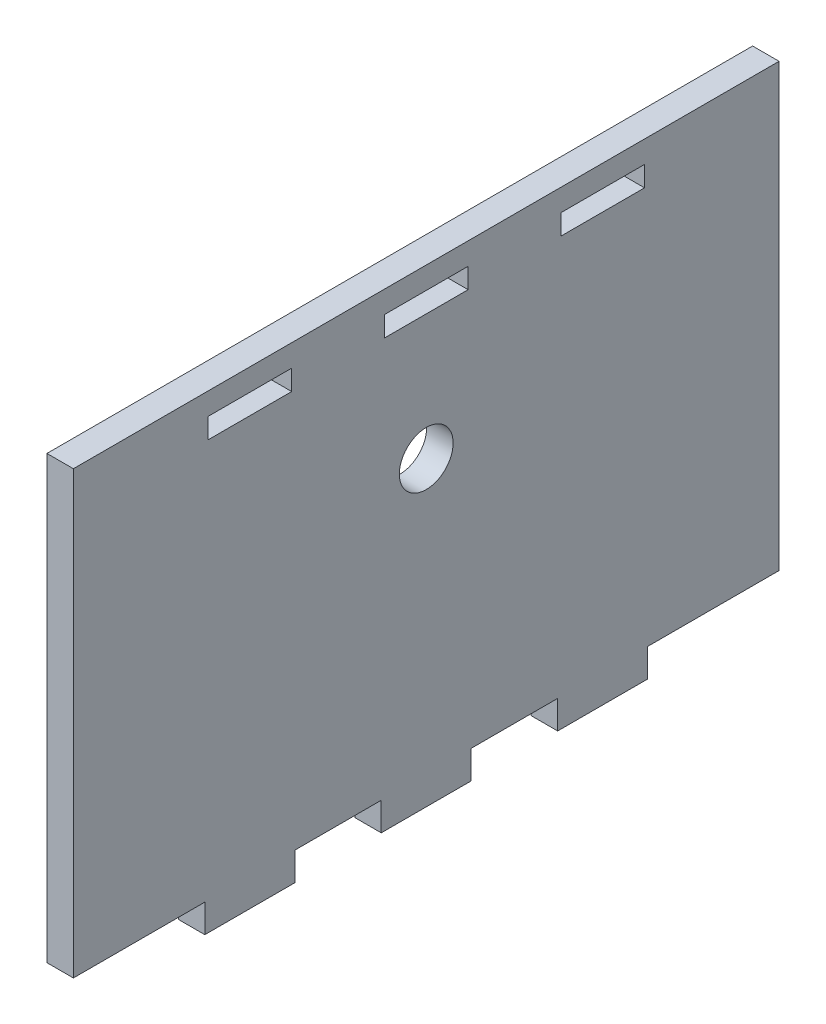
ISO-10303-21;
HEADER;
FILE_DESCRIPTION(('STEP AP214'),'2;1');
FILE_NAME('part.step','',(''),(''),'','','');
FILE_SCHEMA(('AUTOMOTIVE_DESIGN { 1 0 10303 214 1 1 1 1 }'));
ENDSEC;
DATA;
#1=APPLICATION_CONTEXT('core data for automotive mechanical design processes');
#2=APPLICATION_PROTOCOL_DEFINITION('international standard','automotive_design',2000,#1);
#3=PRODUCT_CONTEXT('',#1,'mechanical');
#4=PRODUCT('Part','Part','',(#3));
#5=PRODUCT_RELATED_PRODUCT_CATEGORY('part','',(#4));
#6=PRODUCT_DEFINITION_FORMATION('','',#4);
#7=PRODUCT_DEFINITION_CONTEXT('part definition',#1,'design');
#8=PRODUCT_DEFINITION('design','',#6,#7);
#9=PRODUCT_DEFINITION_SHAPE('','',#8);
#10=(LENGTH_UNIT() NAMED_UNIT(*) SI_UNIT(.MILLI.,.METRE.));
#11=(NAMED_UNIT(*) PLANE_ANGLE_UNIT() SI_UNIT($,.RADIAN.));
#12=(NAMED_UNIT(*) SI_UNIT($,.STERADIAN.) SOLID_ANGLE_UNIT());
#13=UNCERTAINTY_MEASURE_WITH_UNIT(LENGTH_MEASURE(1.E-05),#10,'distance_accuracy_value','');
#14=(GEOMETRIC_REPRESENTATION_CONTEXT(3) GLOBAL_UNCERTAINTY_ASSIGNED_CONTEXT((#13)) GLOBAL_UNIT_ASSIGNED_CONTEXT((#10,
#11,#12)) REPRESENTATION_CONTEXT('',''));
#15=CARTESIAN_POINT('',(0.,0.,0.));
#16=DIRECTION('',(0.,0.,1.));
#17=DIRECTION('',(1.,0.,0.));
#18=AXIS2_PLACEMENT_3D('',#15,#16,#17);
#19=CARTESIAN_POINT('',(3.,0.,0.));
#20=DIRECTION('',(-1.,0.,0.));
#21=DIRECTION('',(0.,0.,1.));
#22=AXIS2_PLACEMENT_3D('',#19,#20,#21);
#23=PLANE('',#22);
#24=DIRECTION('',(0.,-1.,0.));
#25=VECTOR('',#24,1.);
#26=CARTESIAN_POINT('',(3.,20.2,4.75000000000001));
#27=LINE('',#26,#25);
#28=CARTESIAN_POINT('',(3.,22.5,4.75000000000001));
#29=VERTEX_POINT('',#28);
#30=CARTESIAN_POINT('',(3.,20.2,4.75000000000001));
#31=VERTEX_POINT('',#30);
#32=EDGE_CURVE('E280',#29,#31,#27,.T.);
#33=ORIENTED_EDGE('',*,*,#32,.F.);
#34=DIRECTION('',(0.,0.,1.));
#35=VECTOR('',#34,1.);
#36=CARTESIAN_POINT('',(3.,22.5,4.75000000000001));
#37=LINE('',#36,#35);
#38=CARTESIAN_POINT('',(3.,22.5,-4.74999999999999));
#39=VERTEX_POINT('',#38);
#40=EDGE_CURVE('E291',#39,#29,#37,.T.);
#41=ORIENTED_EDGE('',*,*,#40,.F.);
#42=DIRECTION('',(0.,1.,0.));
#43=VECTOR('',#42,1.);
#44=CARTESIAN_POINT('',(3.,20.2,-4.74999999999999));
#45=LINE('',#44,#43);
#46=CARTESIAN_POINT('',(3.,20.2,-4.74999999999999));
#47=VERTEX_POINT('',#46);
#48=EDGE_CURVE('E287',#47,#39,#45,.T.);
#49=ORIENTED_EDGE('',*,*,#48,.F.);
#50=DIRECTION('',(0.,0.,-1.));
#51=VECTOR('',#50,1.);
#52=CARTESIAN_POINT('',(3.,20.2,4.75000000000001));
#53=LINE('',#52,#51);
#54=EDGE_CURVE('E283',#31,#47,#53,.T.);
#55=ORIENTED_EDGE('',*,*,#54,.F.);
#56=EDGE_LOOP('',(#33,#41,#49,#55));
#57=FACE_BOUND('',#56,.T.);
#58=DIRECTION('',(0.,0.,-1.));
#59=VECTOR('',#58,1.);
#60=CARTESIAN_POINT('',(3.,-25.,-25.1));
#61=LINE('',#60,#59);
#62=CARTESIAN_POINT('',(3.,-25.,-25.1));
#63=VERTEX_POINT('',#62);
#64=CARTESIAN_POINT('',(3.,-25.,-40.));
#65=VERTEX_POINT('',#64);
#66=EDGE_CURVE('E366',#63,#65,#61,.T.);
#67=ORIENTED_EDGE('',*,*,#66,.T.);
#68=DIRECTION('',(0.,1.,0.));
#69=VECTOR('',#68,1.);
#70=CARTESIAN_POINT('',(3.,25.,-40.));
#71=LINE('',#70,#69);
#72=CARTESIAN_POINT('',(3.,25.,-40.));
#73=VERTEX_POINT('',#72);
#74=EDGE_CURVE('E370',#65,#73,#71,.T.);
#75=ORIENTED_EDGE('',*,*,#74,.T.);
#76=DIRECTION('',(0.,0.,1.));
#77=VECTOR('',#76,1.);
#78=CARTESIAN_POINT('',(3.,25.,40.));
#79=LINE('',#78,#77);
#80=CARTESIAN_POINT('',(3.,25.,40.));
#81=VERTEX_POINT('',#80);
#82=EDGE_CURVE('E374',#73,#81,#79,.T.);
#83=ORIENTED_EDGE('',*,*,#82,.T.);
#84=DIRECTION('',(0.,-1.,0.));
#85=VECTOR('',#84,1.);
#86=CARTESIAN_POINT('',(3.,25.,40.));
#87=LINE('',#86,#85);
#88=CARTESIAN_POINT('',(3.,-25.,40.));
#89=VERTEX_POINT('',#88);
#90=EDGE_CURVE('E377',#81,#89,#87,.T.);
#91=ORIENTED_EDGE('',*,*,#90,.T.);
#92=DIRECTION('',(0.,0.,-1.));
#93=VECTOR('',#92,1.);
#94=CARTESIAN_POINT('',(3.,-25.,40.));
#95=LINE('',#94,#93);
#96=CARTESIAN_POINT('',(3.,-25.,25.1));
#97=VERTEX_POINT('',#96);
#98=EDGE_CURVE('E380',#89,#97,#95,.T.);
#99=ORIENTED_EDGE('',*,*,#98,.T.);
#100=DIRECTION('',(0.,-1.,0.));
#101=VECTOR('',#100,1.);
#102=CARTESIAN_POINT('',(3.,-25.,25.1));
#103=LINE('',#102,#101);
#104=CARTESIAN_POINT('',(3.,-28.2,25.1));
#105=VERTEX_POINT('',#104);
#106=EDGE_CURVE('E383',#97,#105,#103,.T.);
#107=ORIENTED_EDGE('',*,*,#106,.T.);
#108=DIRECTION('',(0.,0.,-1.));
#109=VECTOR('',#108,1.);
#110=CARTESIAN_POINT('',(3.,-28.2,25.1));
#111=LINE('',#110,#109);
#112=CARTESIAN_POINT('',(3.,-28.2,14.9));
#113=VERTEX_POINT('',#112);
#114=EDGE_CURVE('E386',#105,#113,#111,.T.);
#115=ORIENTED_EDGE('',*,*,#114,.T.);
#116=DIRECTION('',(0.,1.,0.));
#117=VECTOR('',#116,1.);
#118=CARTESIAN_POINT('',(3.,-25.,14.9));
#119=LINE('',#118,#117);
#120=CARTESIAN_POINT('',(3.,-25.,14.9));
#121=VERTEX_POINT('',#120);
#122=EDGE_CURVE('E389',#113,#121,#119,.T.);
#123=ORIENTED_EDGE('',*,*,#122,.T.);
#124=DIRECTION('',(0.,0.,-1.));
#125=VECTOR('',#124,1.);
#126=CARTESIAN_POINT('',(3.,-25.,14.9));
#127=LINE('',#126,#125);
#128=CARTESIAN_POINT('',(3.,-25.,5.1));
#129=VERTEX_POINT('',#128);
#130=EDGE_CURVE('E392',#121,#129,#127,.T.);
#131=ORIENTED_EDGE('',*,*,#130,.T.);
#132=DIRECTION('',(0.,-1.,0.));
#133=VECTOR('',#132,1.);
#134=CARTESIAN_POINT('',(3.,-25.,5.1));
#135=LINE('',#134,#133);
#136=CARTESIAN_POINT('',(3.,-28.2,5.1));
#137=VERTEX_POINT('',#136);
#138=EDGE_CURVE('E395',#129,#137,#135,.T.);
#139=ORIENTED_EDGE('',*,*,#138,.T.);
#140=DIRECTION('',(0.,0.,-1.));
#141=VECTOR('',#140,1.);
#142=CARTESIAN_POINT('',(3.,-28.2,5.1));
#143=LINE('',#142,#141);
#144=CARTESIAN_POINT('',(3.,-28.2,-5.1));
#145=VERTEX_POINT('',#144);
#146=EDGE_CURVE('E398',#137,#145,#143,.T.);
#147=ORIENTED_EDGE('',*,*,#146,.T.);
#148=DIRECTION('',(0.,1.,0.));
#149=VECTOR('',#148,1.);
#150=CARTESIAN_POINT('',(3.,-25.,-5.1));
#151=LINE('',#150,#149);
#152=CARTESIAN_POINT('',(3.,-25.,-5.1));
#153=VERTEX_POINT('',#152);
#154=EDGE_CURVE('E401',#145,#153,#151,.T.);
#155=ORIENTED_EDGE('',*,*,#154,.T.);
#156=DIRECTION('',(0.,0.,-1.));
#157=VECTOR('',#156,1.);
#158=CARTESIAN_POINT('',(3.,-25.,-5.1));
#159=LINE('',#158,#157);
#160=CARTESIAN_POINT('',(3.,-25.,-14.9));
#161=VERTEX_POINT('',#160);
#162=EDGE_CURVE('E404',#153,#161,#159,.T.);
#163=ORIENTED_EDGE('',*,*,#162,.T.);
#164=DIRECTION('',(0.,-1.,0.));
#165=VECTOR('',#164,1.);
#166=CARTESIAN_POINT('',(3.,-25.,-14.9));
#167=LINE('',#166,#165);
#168=CARTESIAN_POINT('',(3.,-28.2,-14.9));
#169=VERTEX_POINT('',#168);
#170=EDGE_CURVE('E407',#161,#169,#167,.T.);
#171=ORIENTED_EDGE('',*,*,#170,.T.);
#172=DIRECTION('',(0.,0.,-1.));
#173=VECTOR('',#172,1.);
#174=CARTESIAN_POINT('',(3.,-28.2,-14.9));
#175=LINE('',#174,#173);
#176=CARTESIAN_POINT('',(3.,-28.2,-25.1));
#177=VERTEX_POINT('',#176);
#178=EDGE_CURVE('E410',#169,#177,#175,.T.);
#179=ORIENTED_EDGE('',*,*,#178,.T.);
#180=DIRECTION('',(0.,1.,0.));
#181=VECTOR('',#180,1.);
#182=CARTESIAN_POINT('',(3.,-25.,-25.1));
#183=LINE('',#182,#181);
#184=EDGE_CURVE('E413',#177,#63,#183,.T.);
#185=ORIENTED_EDGE('',*,*,#184,.T.);
#186=EDGE_LOOP('',(#67,#75,#83,#91,#99,#107,#115,#123,#131,#139,#147,#155,#163,#171,#179,#185));
#187=FACE_BOUND('',#186,.T.);
#188=DIRECTION('',(0.,-1.,0.));
#189=VECTOR('',#188,1.);
#190=CARTESIAN_POINT('',(3.,22.5,24.75));
#191=LINE('',#190,#189);
#192=CARTESIAN_POINT('',(3.,22.5,24.75));
#193=VERTEX_POINT('',#192);
#194=CARTESIAN_POINT('',(3.,20.2,24.75));
#195=VERTEX_POINT('',#194);
#196=EDGE_CURVE('E323',#193,#195,#191,.T.);
#197=ORIENTED_EDGE('',*,*,#196,.F.);
#198=DIRECTION('',(0.,0.,1.));
#199=VECTOR('',#198,1.);
#200=CARTESIAN_POINT('',(3.,22.5,24.75));
#201=LINE('',#200,#199);
#202=CARTESIAN_POINT('',(3.,22.5,15.25));
#203=VERTEX_POINT('',#202);
#204=EDGE_CURVE('E334',#203,#193,#201,.T.);
#205=ORIENTED_EDGE('',*,*,#204,.F.);
#206=DIRECTION('',(0.,1.,0.));
#207=VECTOR('',#206,1.);
#208=CARTESIAN_POINT('',(3.,22.5,15.25));
#209=LINE('',#208,#207);
#210=CARTESIAN_POINT('',(3.,20.2,15.25));
#211=VERTEX_POINT('',#210);
#212=EDGE_CURVE('E330',#211,#203,#209,.T.);
#213=ORIENTED_EDGE('',*,*,#212,.F.);
#214=DIRECTION('',(0.,0.,-1.));
#215=VECTOR('',#214,1.);
#216=CARTESIAN_POINT('',(3.,20.2,24.75));
#217=LINE('',#216,#215);
#218=EDGE_CURVE('E326',#195,#211,#217,.T.);
#219=ORIENTED_EDGE('',*,*,#218,.F.);
#220=EDGE_LOOP('',(#197,#205,#213,#219));
#221=FACE_BOUND('',#220,.T.);
#222=DIRECTION('',(0.,1.,0.));
#223=VECTOR('',#222,1.);
#224=CARTESIAN_POINT('',(3.,22.5,-24.75));
#225=LINE('',#224,#223);
#226=CARTESIAN_POINT('',(3.,20.2,-24.75));
#227=VERTEX_POINT('',#226);
#228=CARTESIAN_POINT('',(3.,22.5,-24.75));
#229=VERTEX_POINT('',#228);
#230=EDGE_CURVE('E229',#227,#229,#225,.T.);
#231=ORIENTED_EDGE('',*,*,#230,.F.);
#232=DIRECTION('',(0.,0.,-1.));
#233=VECTOR('',#232,1.);
#234=CARTESIAN_POINT('',(3.,20.2,-24.75));
#235=LINE('',#234,#233);
#236=CARTESIAN_POINT('',(3.,20.2,-15.25));
#237=VERTEX_POINT('',#236);
#238=EDGE_CURVE('E256',#237,#227,#235,.T.);
#239=ORIENTED_EDGE('',*,*,#238,.F.);
#240=DIRECTION('',(0.,-1.,0.));
#241=VECTOR('',#240,1.);
#242=CARTESIAN_POINT('',(3.,22.5,-15.25));
#243=LINE('',#242,#241);
#244=CARTESIAN_POINT('',(3.,22.5,-15.25));
#245=VERTEX_POINT('',#244);
#246=EDGE_CURVE('E252',#245,#237,#243,.T.);
#247=ORIENTED_EDGE('',*,*,#246,.F.);
#248=DIRECTION('',(0.,0.,1.));
#249=VECTOR('',#248,1.);
#250=CARTESIAN_POINT('',(3.,22.5,-24.75));
#251=LINE('',#250,#249);
#252=EDGE_CURVE('E238',#229,#245,#251,.T.);
#253=ORIENTED_EDGE('',*,*,#252,.F.);
#254=EDGE_LOOP('',(#231,#239,#247,#253));
#255=FACE_BOUND('',#254,.T.);
#256=CARTESIAN_POINT('',(3.,6.,0.));
#257=DIRECTION('',(1.,0.,0.));
#258=DIRECTION('',(0.,0.,-1.));
#259=AXIS2_PLACEMENT_3D('',#256,#257,#258);
#260=CIRCLE('',#259,3.05);
#261=CARTESIAN_POINT('',(3.,6.,-3.05));
#262=VERTEX_POINT('',#261);
#263=EDGE_CURVE('E264',#262,#262,#260,.T.);
#264=ORIENTED_EDGE('',*,*,#263,.F.);
#265=EDGE_LOOP('',(#264));
#266=FACE_BOUND('',#265,.T.);
#267=ADVANCED_FACE('F43',(#57,#187,#221,#255,#266),#23,.F.);
#268=CARTESIAN_POINT('',(0.,0.,0.));
#269=DIRECTION('',(-1.,0.,0.));
#270=DIRECTION('',(0.,0.,1.));
#271=AXIS2_PLACEMENT_3D('',#268,#269,#270);
#272=PLANE('',#271);
#273=DIRECTION('',(0.,0.,-1.));
#274=VECTOR('',#273,1.);
#275=CARTESIAN_POINT('',(0.,20.2,-24.75));
#276=LINE('',#275,#274);
#277=CARTESIAN_POINT('',(0.,20.2,-15.25));
#278=VERTEX_POINT('',#277);
#279=CARTESIAN_POINT('',(0.,20.2,-24.75));
#280=VERTEX_POINT('',#279);
#281=EDGE_CURVE('E239',#278,#280,#276,.T.);
#282=ORIENTED_EDGE('',*,*,#281,.T.);
#283=DIRECTION('',(0.,1.,0.));
#284=VECTOR('',#283,1.);
#285=CARTESIAN_POINT('',(0.,22.5,-24.75));
#286=LINE('',#285,#284);
#287=CARTESIAN_POINT('',(0.,22.5,-24.75));
#288=VERTEX_POINT('',#287);
#289=EDGE_CURVE('E67',#280,#288,#286,.T.);
#290=ORIENTED_EDGE('',*,*,#289,.T.);
#291=DIRECTION('',(0.,0.,1.));
#292=VECTOR('',#291,1.);
#293=CARTESIAN_POINT('',(0.,22.5,-24.75));
#294=LINE('',#293,#292);
#295=CARTESIAN_POINT('',(0.,22.5,-15.25));
#296=VERTEX_POINT('',#295);
#297=EDGE_CURVE('E245',#288,#296,#294,.T.);
#298=ORIENTED_EDGE('',*,*,#297,.T.);
#299=DIRECTION('',(0.,-1.,0.));
#300=VECTOR('',#299,1.);
#301=CARTESIAN_POINT('',(0.,22.5,-15.25));
#302=LINE('',#301,#300);
#303=EDGE_CURVE('E267',#296,#278,#302,.T.);
#304=ORIENTED_EDGE('',*,*,#303,.T.);
#305=EDGE_LOOP('',(#282,#290,#298,#304));
#306=FACE_BOUND('',#305,.T.);
#307=DIRECTION('',(0.,0.,1.));
#308=VECTOR('',#307,1.);
#309=CARTESIAN_POINT('',(0.,22.5,4.75000000000001));
#310=LINE('',#309,#308);
#311=CARTESIAN_POINT('',(0.,22.5,-4.74999999999999));
#312=VERTEX_POINT('',#311);
#313=CARTESIAN_POINT('',(0.,22.5,4.75000000000001));
#314=VERTEX_POINT('',#313);
#315=EDGE_CURVE('E284',#312,#314,#310,.T.);
#316=ORIENTED_EDGE('',*,*,#315,.T.);
#317=DIRECTION('',(0.,-1.,0.));
#318=VECTOR('',#317,1.);
#319=CARTESIAN_POINT('',(0.,20.2,4.75000000000001));
#320=LINE('',#319,#318);
#321=CARTESIAN_POINT('',(0.,20.2,4.75000000000001));
#322=VERTEX_POINT('',#321);
#323=EDGE_CURVE('E247',#314,#322,#320,.T.);
#324=ORIENTED_EDGE('',*,*,#323,.T.);
#325=DIRECTION('',(0.,0.,-1.));
#326=VECTOR('',#325,1.);
#327=CARTESIAN_POINT('',(0.,20.2,4.75000000000001));
#328=LINE('',#327,#326);
#329=CARTESIAN_POINT('',(0.,20.2,-4.74999999999999));
#330=VERTEX_POINT('',#329);
#331=EDGE_CURVE('E298',#322,#330,#328,.T.);
#332=ORIENTED_EDGE('',*,*,#331,.T.);
#333=DIRECTION('',(0.,1.,0.));
#334=VECTOR('',#333,1.);
#335=CARTESIAN_POINT('',(0.,20.2,-4.74999999999999));
#336=LINE('',#335,#334);
#337=EDGE_CURVE('E302',#330,#312,#336,.T.);
#338=ORIENTED_EDGE('',*,*,#337,.T.);
#339=EDGE_LOOP('',(#316,#324,#332,#338));
#340=FACE_BOUND('',#339,.T.);
#341=DIRECTION('',(0.,0.,1.));
#342=VECTOR('',#341,1.);
#343=CARTESIAN_POINT('',(0.,22.5,24.75));
#344=LINE('',#343,#342);
#345=CARTESIAN_POINT('',(0.,22.5,15.25));
#346=VERTEX_POINT('',#345);
#347=CARTESIAN_POINT('',(0.,22.5,24.75));
#348=VERTEX_POINT('',#347);
#349=EDGE_CURVE('E327',#346,#348,#344,.T.);
#350=ORIENTED_EDGE('',*,*,#349,.T.);
#351=DIRECTION('',(0.,-1.,0.));
#352=VECTOR('',#351,1.);
#353=CARTESIAN_POINT('',(0.,22.5,24.75));
#354=LINE('',#353,#352);
#355=CARTESIAN_POINT('',(0.,20.2,24.75));
#356=VERTEX_POINT('',#355);
#357=EDGE_CURVE('E322',#348,#356,#354,.T.);
#358=ORIENTED_EDGE('',*,*,#357,.T.);
#359=DIRECTION('',(0.,0.,-1.));
#360=VECTOR('',#359,1.);
#361=CARTESIAN_POINT('',(0.,20.2,24.75));
#362=LINE('',#361,#360);
#363=CARTESIAN_POINT('',(0.,20.2,15.25));
#364=VERTEX_POINT('',#363);
#365=EDGE_CURVE('E341',#356,#364,#362,.T.);
#366=ORIENTED_EDGE('',*,*,#365,.T.);
#367=DIRECTION('',(0.,1.,0.));
#368=VECTOR('',#367,1.);
#369=CARTESIAN_POINT('',(0.,22.5,15.25));
#370=LINE('',#369,#368);
#371=EDGE_CURVE('E345',#364,#346,#370,.T.);
#372=ORIENTED_EDGE('',*,*,#371,.T.);
#373=EDGE_LOOP('',(#350,#358,#366,#372));
#374=FACE_BOUND('',#373,.T.);
#375=DIRECTION('',(0.,0.,-1.));
#376=VECTOR('',#375,1.);
#377=CARTESIAN_POINT('',(0.,-25.,-25.1));
#378=LINE('',#377,#376);
#379=CARTESIAN_POINT('',(0.,-25.,-25.1));
#380=VERTEX_POINT('',#379);
#381=CARTESIAN_POINT('',(0.,-25.,-40.));
#382=VERTEX_POINT('',#381);
#383=EDGE_CURVE('E365',#380,#382,#378,.T.);
#384=ORIENTED_EDGE('',*,*,#383,.F.);
#385=DIRECTION('',(0.,1.,0.));
#386=VECTOR('',#385,1.);
#387=CARTESIAN_POINT('',(0.,-25.,-25.1));
#388=LINE('',#387,#386);
#389=CARTESIAN_POINT('',(0.,-28.2,-25.1));
#390=VERTEX_POINT('',#389);
#391=EDGE_CURVE('E371',#390,#380,#388,.T.);
#392=ORIENTED_EDGE('',*,*,#391,.F.);
#393=DIRECTION('',(0.,0.,-1.));
#394=VECTOR('',#393,1.);
#395=CARTESIAN_POINT('',(0.,-28.2,-14.9));
#396=LINE('',#395,#394);
#397=CARTESIAN_POINT('',(0.,-28.2,-14.9));
#398=VERTEX_POINT('',#397);
#399=EDGE_CURVE('E459',#398,#390,#396,.T.);
#400=ORIENTED_EDGE('',*,*,#399,.F.);
#401=DIRECTION('',(0.,-1.,0.));
#402=VECTOR('',#401,1.);
#403=CARTESIAN_POINT('',(0.,-25.,-14.9));
#404=LINE('',#403,#402);
#405=CARTESIAN_POINT('',(0.,-25.,-14.9));
#406=VERTEX_POINT('',#405);
#407=EDGE_CURVE('E456',#406,#398,#404,.T.);
#408=ORIENTED_EDGE('',*,*,#407,.F.);
#409=DIRECTION('',(0.,0.,-1.));
#410=VECTOR('',#409,1.);
#411=CARTESIAN_POINT('',(0.,-25.,-5.1));
#412=LINE('',#411,#410);
#413=CARTESIAN_POINT('',(0.,-25.,-5.1));
#414=VERTEX_POINT('',#413);
#415=EDGE_CURVE('E453',#414,#406,#412,.T.);
#416=ORIENTED_EDGE('',*,*,#415,.F.);
#417=DIRECTION('',(0.,1.,0.));
#418=VECTOR('',#417,1.);
#419=CARTESIAN_POINT('',(0.,-25.,-5.1));
#420=LINE('',#419,#418);
#421=CARTESIAN_POINT('',(0.,-28.2,-5.1));
#422=VERTEX_POINT('',#421);
#423=EDGE_CURVE('E450',#422,#414,#420,.T.);
#424=ORIENTED_EDGE('',*,*,#423,.F.);
#425=DIRECTION('',(0.,0.,-1.));
#426=VECTOR('',#425,1.);
#427=CARTESIAN_POINT('',(0.,-28.2,5.1));
#428=LINE('',#427,#426);
#429=CARTESIAN_POINT('',(0.,-28.2,5.1));
#430=VERTEX_POINT('',#429);
#431=EDGE_CURVE('E447',#430,#422,#428,.T.);
#432=ORIENTED_EDGE('',*,*,#431,.F.);
#433=DIRECTION('',(0.,-1.,0.));
#434=VECTOR('',#433,1.);
#435=CARTESIAN_POINT('',(0.,-25.,5.1));
#436=LINE('',#435,#434);
#437=CARTESIAN_POINT('',(0.,-25.,5.1));
#438=VERTEX_POINT('',#437);
#439=EDGE_CURVE('E444',#438,#430,#436,.T.);
#440=ORIENTED_EDGE('',*,*,#439,.F.);
#441=DIRECTION('',(0.,0.,-1.));
#442=VECTOR('',#441,1.);
#443=CARTESIAN_POINT('',(0.,-25.,14.9));
#444=LINE('',#443,#442);
#445=CARTESIAN_POINT('',(0.,-25.,14.9));
#446=VERTEX_POINT('',#445);
#447=EDGE_CURVE('E441',#446,#438,#444,.T.);
#448=ORIENTED_EDGE('',*,*,#447,.F.);
#449=DIRECTION('',(0.,1.,0.));
#450=VECTOR('',#449,1.);
#451=CARTESIAN_POINT('',(0.,-25.,14.9));
#452=LINE('',#451,#450);
#453=CARTESIAN_POINT('',(0.,-28.2,14.9));
#454=VERTEX_POINT('',#453);
#455=EDGE_CURVE('E438',#454,#446,#452,.T.);
#456=ORIENTED_EDGE('',*,*,#455,.F.);
#457=DIRECTION('',(0.,0.,-1.));
#458=VECTOR('',#457,1.);
#459=CARTESIAN_POINT('',(0.,-28.2,25.1));
#460=LINE('',#459,#458);
#461=CARTESIAN_POINT('',(0.,-28.2,25.1));
#462=VERTEX_POINT('',#461);
#463=EDGE_CURVE('E435',#462,#454,#460,.T.);
#464=ORIENTED_EDGE('',*,*,#463,.F.);
#465=DIRECTION('',(0.,-1.,0.));
#466=VECTOR('',#465,1.);
#467=CARTESIAN_POINT('',(0.,-25.,25.1));
#468=LINE('',#467,#466);
#469=CARTESIAN_POINT('',(0.,-25.,25.1));
#470=VERTEX_POINT('',#469);
#471=EDGE_CURVE('E432',#470,#462,#468,.T.);
#472=ORIENTED_EDGE('',*,*,#471,.F.);
#473=DIRECTION('',(0.,0.,-1.));
#474=VECTOR('',#473,1.);
#475=CARTESIAN_POINT('',(0.,-25.,40.));
#476=LINE('',#475,#474);
#477=CARTESIAN_POINT('',(0.,-25.,40.));
#478=VERTEX_POINT('',#477);
#479=EDGE_CURVE('E429',#478,#470,#476,.T.);
#480=ORIENTED_EDGE('',*,*,#479,.F.);
#481=DIRECTION('',(0.,-1.,0.));
#482=VECTOR('',#481,1.);
#483=CARTESIAN_POINT('',(0.,25.,40.));
#484=LINE('',#483,#482);
#485=CARTESIAN_POINT('',(0.,25.,40.));
#486=VERTEX_POINT('',#485);
#487=EDGE_CURVE('E426',#486,#478,#484,.T.);
#488=ORIENTED_EDGE('',*,*,#487,.F.);
#489=DIRECTION('',(0.,0.,1.));
#490=VECTOR('',#489,1.);
#491=CARTESIAN_POINT('',(0.,25.,40.));
#492=LINE('',#491,#490);
#493=CARTESIAN_POINT('',(0.,25.,-40.));
#494=VERTEX_POINT('',#493);
#495=EDGE_CURVE('E423',#494,#486,#492,.T.);
#496=ORIENTED_EDGE('',*,*,#495,.F.);
#497=DIRECTION('',(0.,1.,0.));
#498=VECTOR('',#497,1.);
#499=CARTESIAN_POINT('',(0.,25.,-40.));
#500=LINE('',#499,#498);
#501=EDGE_CURVE('E420',#382,#494,#500,.T.);
#502=ORIENTED_EDGE('',*,*,#501,.F.);
#503=EDGE_LOOP('',(#384,#392,#400,#408,#416,#424,#432,#440,#448,#456,#464,#472,#480,#488,#496,#502));
#504=FACE_BOUND('',#503,.T.);
#505=CARTESIAN_POINT('',(0.,6.,0.));
#506=DIRECTION('',(1.,0.,0.));
#507=DIRECTION('',(0.,0.,-1.));
#508=AXIS2_PLACEMENT_3D('',#505,#506,#507);
#509=CIRCLE('',#508,3.05);
#510=CARTESIAN_POINT('',(0.,6.,-3.05));
#511=VERTEX_POINT('',#510);
#512=EDGE_CURVE('E939',#511,#511,#509,.T.);
#513=ORIENTED_EDGE('',*,*,#512,.T.);
#514=EDGE_LOOP('',(#513));
#515=FACE_BOUND('',#514,.T.);
#516=ADVANCED_FACE('F530',(#306,#340,#374,#504,#515),#272,.T.);
#517=CARTESIAN_POINT('',(3.,-25.,-25.1));
#518=DIRECTION('',(0.,1.,0.));
#519=DIRECTION('',(0.,0.,1.));
#520=AXIS2_PLACEMENT_3D('',#517,#518,#519);
#521=PLANE('',#520);
#522=ORIENTED_EDGE('',*,*,#383,.T.);
#523=DIRECTION('',(-1.,0.,0.));
#524=VECTOR('',#523,1.);
#525=CARTESIAN_POINT('',(3.,-25.,-40.));
#526=LINE('',#525,#524);
#527=EDGE_CURVE('E11',#65,#382,#526,.T.);
#528=ORIENTED_EDGE('',*,*,#527,.F.);
#529=ORIENTED_EDGE('',*,*,#66,.F.);
#530=DIRECTION('',(-1.,0.,0.));
#531=VECTOR('',#530,1.);
#532=CARTESIAN_POINT('',(3.,-25.,-25.1));
#533=LINE('',#532,#531);
#534=EDGE_CURVE('E416',#63,#380,#533,.T.);
#535=ORIENTED_EDGE('',*,*,#534,.T.);
#536=EDGE_LOOP('',(#522,#528,#529,#535));
#537=FACE_BOUND('',#536,.T.);
#538=ADVANCED_FACE('F45',(#537),#521,.F.);
#539=CARTESIAN_POINT('',(3.,25.,-40.));
#540=DIRECTION('',(0.,0.,1.));
#541=DIRECTION('',(0.,-1.,0.));
#542=AXIS2_PLACEMENT_3D('',#539,#540,#541);
#543=PLANE('',#542);
#544=ORIENTED_EDGE('',*,*,#501,.T.);
#545=DIRECTION('',(-1.,0.,0.));
#546=VECTOR('',#545,1.);
#547=CARTESIAN_POINT('',(3.,25.,-40.));
#548=LINE('',#547,#546);
#549=EDGE_CURVE('E52',#73,#494,#548,.T.);
#550=ORIENTED_EDGE('',*,*,#549,.F.);
#551=ORIENTED_EDGE('',*,*,#74,.F.);
#552=ORIENTED_EDGE('',*,*,#527,.T.);
#553=EDGE_LOOP('',(#544,#550,#551,#552));
#554=FACE_BOUND('',#553,.T.);
#555=ADVANCED_FACE('F548',(#554),#543,.F.);
#556=CARTESIAN_POINT('',(3.,25.,40.));
#557=DIRECTION('',(0.,-1.,0.));
#558=DIRECTION('',(0.,0.,-1.));
#559=AXIS2_PLACEMENT_3D('',#556,#557,#558);
#560=PLANE('',#559);
#561=ORIENTED_EDGE('',*,*,#495,.T.);
#562=DIRECTION('',(-1.,0.,0.));
#563=VECTOR('',#562,1.);
#564=CARTESIAN_POINT('',(3.,25.,40.));
#565=LINE('',#564,#563);
#566=EDGE_CURVE('E515',#81,#486,#565,.T.);
#567=ORIENTED_EDGE('',*,*,#566,.F.);
#568=ORIENTED_EDGE('',*,*,#82,.F.);
#569=ORIENTED_EDGE('',*,*,#549,.T.);
#570=EDGE_LOOP('',(#561,#567,#568,#569));
#571=FACE_BOUND('',#570,.T.);
#572=ADVANCED_FACE('F524',(#571),#560,.F.);
#573=CARTESIAN_POINT('',(3.,25.,40.));
#574=DIRECTION('',(0.,0.,-1.));
#575=DIRECTION('',(0.,1.,0.));
#576=AXIS2_PLACEMENT_3D('',#573,#574,#575);
#577=PLANE('',#576);
#578=ORIENTED_EDGE('',*,*,#487,.T.);
#579=DIRECTION('',(-1.,0.,0.));
#580=VECTOR('',#579,1.);
#581=CARTESIAN_POINT('',(3.,-25.,40.));
#582=LINE('',#581,#580);
#583=EDGE_CURVE('E511',#89,#478,#582,.T.);
#584=ORIENTED_EDGE('',*,*,#583,.F.);
#585=ORIENTED_EDGE('',*,*,#90,.F.);
#586=ORIENTED_EDGE('',*,*,#566,.T.);
#587=EDGE_LOOP('',(#578,#584,#585,#586));
#588=FACE_BOUND('',#587,.T.);
#589=ADVANCED_FACE('F536',(#588),#577,.F.);
#590=CARTESIAN_POINT('',(3.,-25.,40.));
#591=DIRECTION('',(0.,1.,0.));
#592=DIRECTION('',(0.,0.,1.));
#593=AXIS2_PLACEMENT_3D('',#590,#591,#592);
#594=PLANE('',#593);
#595=ORIENTED_EDGE('',*,*,#479,.T.);
#596=DIRECTION('',(-1.,0.,0.));
#597=VECTOR('',#596,1.);
#598=CARTESIAN_POINT('',(3.,-25.,25.1));
#599=LINE('',#598,#597);
#600=EDGE_CURVE('E507',#97,#470,#599,.T.);
#601=ORIENTED_EDGE('',*,*,#600,.F.);
#602=ORIENTED_EDGE('',*,*,#98,.F.);
#603=ORIENTED_EDGE('',*,*,#583,.T.);
#604=EDGE_LOOP('',(#595,#601,#602,#603));
#605=FACE_BOUND('',#604,.T.);
#606=ADVANCED_FACE('F540',(#605),#594,.F.);
#607=CARTESIAN_POINT('',(3.,-25.,25.1));
#608=DIRECTION('',(0.,0.,-1.));
#609=DIRECTION('',(-1.,0.,0.));
#610=AXIS2_PLACEMENT_3D('',#607,#608,#609);
#611=PLANE('',#610);
#612=ORIENTED_EDGE('',*,*,#471,.T.);
#613=DIRECTION('',(-1.,0.,0.));
#614=VECTOR('',#613,1.);
#615=CARTESIAN_POINT('',(3.,-28.2,25.1));
#616=LINE('',#615,#614);
#617=EDGE_CURVE('E503',#105,#462,#616,.T.);
#618=ORIENTED_EDGE('',*,*,#617,.F.);
#619=ORIENTED_EDGE('',*,*,#106,.F.);
#620=ORIENTED_EDGE('',*,*,#600,.T.);
#621=EDGE_LOOP('',(#612,#618,#619,#620));
#622=FACE_BOUND('',#621,.T.);
#623=ADVANCED_FACE('F601',(#622),#611,.F.);
#624=CARTESIAN_POINT('',(3.,-28.2,25.1));
#625=DIRECTION('',(0.,1.,0.));
#626=DIRECTION('',(0.,0.,1.));
#627=AXIS2_PLACEMENT_3D('',#624,#625,#626);
#628=PLANE('',#627);
#629=ORIENTED_EDGE('',*,*,#463,.T.);
#630=DIRECTION('',(-1.,0.,0.));
#631=VECTOR('',#630,1.);
#632=CARTESIAN_POINT('',(3.,-28.2,14.9));
#633=LINE('',#632,#631);
#634=EDGE_CURVE('E499',#113,#454,#633,.T.);
#635=ORIENTED_EDGE('',*,*,#634,.F.);
#636=ORIENTED_EDGE('',*,*,#114,.F.);
#637=ORIENTED_EDGE('',*,*,#617,.T.);
#638=EDGE_LOOP('',(#629,#635,#636,#637));
#639=FACE_BOUND('',#638,.T.);
#640=ADVANCED_FACE('F598',(#639),#628,.F.);
#641=CARTESIAN_POINT('',(3.,-25.,14.9));
#642=DIRECTION('',(0.,0.,1.));
#643=DIRECTION('',(0.,-1.,0.));
#644=AXIS2_PLACEMENT_3D('',#641,#642,#643);
#645=PLANE('',#644);
#646=ORIENTED_EDGE('',*,*,#455,.T.);
#647=DIRECTION('',(-1.,0.,0.));
#648=VECTOR('',#647,1.);
#649=CARTESIAN_POINT('',(3.,-25.,14.9));
#650=LINE('',#649,#648);
#651=EDGE_CURVE('E495',#121,#446,#650,.T.);
#652=ORIENTED_EDGE('',*,*,#651,.F.);
#653=ORIENTED_EDGE('',*,*,#122,.F.);
#654=ORIENTED_EDGE('',*,*,#634,.T.);
#655=EDGE_LOOP('',(#646,#652,#653,#654));
#656=FACE_BOUND('',#655,.T.);
#657=ADVANCED_FACE('F594',(#656),#645,.F.);
#658=CARTESIAN_POINT('',(3.,-25.,14.9));
#659=DIRECTION('',(0.,1.,0.));
#660=DIRECTION('',(0.,0.,1.));
#661=AXIS2_PLACEMENT_3D('',#658,#659,#660);
#662=PLANE('',#661);
#663=ORIENTED_EDGE('',*,*,#447,.T.);
#664=DIRECTION('',(-1.,0.,0.));
#665=VECTOR('',#664,1.);
#666=CARTESIAN_POINT('',(3.,-25.,5.1));
#667=LINE('',#666,#665);
#668=EDGE_CURVE('E491',#129,#438,#667,.T.);
#669=ORIENTED_EDGE('',*,*,#668,.F.);
#670=ORIENTED_EDGE('',*,*,#130,.F.);
#671=ORIENTED_EDGE('',*,*,#651,.T.);
#672=EDGE_LOOP('',(#663,#669,#670,#671));
#673=FACE_BOUND('',#672,.T.);
#674=ADVANCED_FACE('F590',(#673),#662,.F.);
#675=CARTESIAN_POINT('',(3.,-25.,5.1));
#676=DIRECTION('',(0.,0.,-1.));
#677=DIRECTION('',(0.,1.,0.));
#678=AXIS2_PLACEMENT_3D('',#675,#676,#677);
#679=PLANE('',#678);
#680=ORIENTED_EDGE('',*,*,#439,.T.);
#681=DIRECTION('',(-1.,0.,0.));
#682=VECTOR('',#681,1.);
#683=CARTESIAN_POINT('',(3.,-28.2,5.1));
#684=LINE('',#683,#682);
#685=EDGE_CURVE('E487',#137,#430,#684,.T.);
#686=ORIENTED_EDGE('',*,*,#685,.F.);
#687=ORIENTED_EDGE('',*,*,#138,.F.);
#688=ORIENTED_EDGE('',*,*,#668,.T.);
#689=EDGE_LOOP('',(#680,#686,#687,#688));
#690=FACE_BOUND('',#689,.T.);
#691=ADVANCED_FACE('F585',(#690),#679,.F.);
#692=CARTESIAN_POINT('',(3.,-28.2,5.1));
#693=DIRECTION('',(0.,1.,0.));
#694=DIRECTION('',(0.,0.,1.));
#695=AXIS2_PLACEMENT_3D('',#692,#693,#694);
#696=PLANE('',#695);
#697=ORIENTED_EDGE('',*,*,#431,.T.);
#698=DIRECTION('',(-1.,0.,0.));
#699=VECTOR('',#698,1.);
#700=CARTESIAN_POINT('',(3.,-28.2,-5.1));
#701=LINE('',#700,#699);
#702=EDGE_CURVE('E483',#145,#422,#701,.T.);
#703=ORIENTED_EDGE('',*,*,#702,.F.);
#704=ORIENTED_EDGE('',*,*,#146,.F.);
#705=ORIENTED_EDGE('',*,*,#685,.T.);
#706=EDGE_LOOP('',(#697,#703,#704,#705));
#707=FACE_BOUND('',#706,.T.);
#708=ADVANCED_FACE('F579',(#707),#696,.F.);
#709=CARTESIAN_POINT('',(3.,-25.,-5.1));
#710=DIRECTION('',(0.,0.,1.));
#711=DIRECTION('',(0.,-1.,0.));
#712=AXIS2_PLACEMENT_3D('',#709,#710,#711);
#713=PLANE('',#712);
#714=ORIENTED_EDGE('',*,*,#423,.T.);
#715=DIRECTION('',(-1.,0.,0.));
#716=VECTOR('',#715,1.);
#717=CARTESIAN_POINT('',(3.,-25.,-5.1));
#718=LINE('',#717,#716);
#719=EDGE_CURVE('E479',#153,#414,#718,.T.);
#720=ORIENTED_EDGE('',*,*,#719,.F.);
#721=ORIENTED_EDGE('',*,*,#154,.F.);
#722=ORIENTED_EDGE('',*,*,#702,.T.);
#723=EDGE_LOOP('',(#714,#720,#721,#722));
#724=FACE_BOUND('',#723,.T.);
#725=ADVANCED_FACE('F575',(#724),#713,.F.);
#726=CARTESIAN_POINT('',(3.,-25.,-5.1));
#727=DIRECTION('',(0.,1.,0.));
#728=DIRECTION('',(0.,0.,1.));
#729=AXIS2_PLACEMENT_3D('',#726,#727,#728);
#730=PLANE('',#729);
#731=ORIENTED_EDGE('',*,*,#415,.T.);
#732=DIRECTION('',(-1.,0.,0.));
#733=VECTOR('',#732,1.);
#734=CARTESIAN_POINT('',(3.,-25.,-14.9));
#735=LINE('',#734,#733);
#736=EDGE_CURVE('E475',#161,#406,#735,.T.);
#737=ORIENTED_EDGE('',*,*,#736,.F.);
#738=ORIENTED_EDGE('',*,*,#162,.F.);
#739=ORIENTED_EDGE('',*,*,#719,.T.);
#740=EDGE_LOOP('',(#731,#737,#738,#739));
#741=FACE_BOUND('',#740,.T.);
#742=ADVANCED_FACE('F570',(#741),#730,.F.);
#743=CARTESIAN_POINT('',(3.,-25.,-14.9));
#744=DIRECTION('',(0.,0.,-1.));
#745=DIRECTION('',(-1.,0.,0.));
#746=AXIS2_PLACEMENT_3D('',#743,#744,#745);
#747=PLANE('',#746);
#748=ORIENTED_EDGE('',*,*,#407,.T.);
#749=DIRECTION('',(-1.,0.,0.));
#750=VECTOR('',#749,1.);
#751=CARTESIAN_POINT('',(3.,-28.2,-14.9));
#752=LINE('',#751,#750);
#753=EDGE_CURVE('E471',#169,#398,#752,.T.);
#754=ORIENTED_EDGE('',*,*,#753,.F.);
#755=ORIENTED_EDGE('',*,*,#170,.F.);
#756=ORIENTED_EDGE('',*,*,#736,.T.);
#757=EDGE_LOOP('',(#748,#754,#755,#756));
#758=FACE_BOUND('',#757,.T.);
#759=ADVANCED_FACE('F564',(#758),#747,.F.);
#760=CARTESIAN_POINT('',(3.,-28.2,-14.9));
#761=DIRECTION('',(0.,1.,0.));
#762=DIRECTION('',(0.,0.,1.));
#763=AXIS2_PLACEMENT_3D('',#760,#761,#762);
#764=PLANE('',#763);
#765=ORIENTED_EDGE('',*,*,#399,.T.);
#766=DIRECTION('',(-1.,0.,0.));
#767=VECTOR('',#766,1.);
#768=CARTESIAN_POINT('',(3.,-28.2,-25.1));
#769=LINE('',#768,#767);
#770=EDGE_CURVE('E467',#177,#390,#769,.T.);
#771=ORIENTED_EDGE('',*,*,#770,.F.);
#772=ORIENTED_EDGE('',*,*,#178,.F.);
#773=ORIENTED_EDGE('',*,*,#753,.T.);
#774=EDGE_LOOP('',(#765,#771,#772,#773));
#775=FACE_BOUND('',#774,.T.);
#776=ADVANCED_FACE('F560',(#775),#764,.F.);
#777=CARTESIAN_POINT('',(3.,-25.,-25.1));
#778=DIRECTION('',(0.,0.,1.));
#779=DIRECTION('',(0.,-1.,0.));
#780=AXIS2_PLACEMENT_3D('',#777,#778,#779);
#781=PLANE('',#780);
#782=ORIENTED_EDGE('',*,*,#391,.T.);
#783=ORIENTED_EDGE('',*,*,#534,.F.);
#784=ORIENTED_EDGE('',*,*,#184,.F.);
#785=ORIENTED_EDGE('',*,*,#770,.T.);
#786=EDGE_LOOP('',(#782,#783,#784,#785));
#787=FACE_BOUND('',#786,.T.);
#788=ADVANCED_FACE('F555',(#787),#781,.F.);
#789=CARTESIAN_POINT('',(3.,22.5,24.75));
#790=DIRECTION('',(0.,0.,-1.));
#791=DIRECTION('',(-1.,0.,0.));
#792=AXIS2_PLACEMENT_3D('',#789,#790,#791);
#793=PLANE('',#792);
#794=ORIENTED_EDGE('',*,*,#357,.F.);
#795=DIRECTION('',(-1.,0.,0.));
#796=VECTOR('',#795,1.);
#797=CARTESIAN_POINT('',(3.,22.5,24.75));
#798=LINE('',#797,#796);
#799=EDGE_CURVE('E337',#193,#348,#798,.T.);
#800=ORIENTED_EDGE('',*,*,#799,.F.);
#801=ORIENTED_EDGE('',*,*,#196,.T.);
#802=DIRECTION('',(-1.,0.,0.));
#803=VECTOR('',#802,1.);
#804=CARTESIAN_POINT('',(3.,20.2,24.75));
#805=LINE('',#804,#803);
#806=EDGE_CURVE('E361',#195,#356,#805,.T.);
#807=ORIENTED_EDGE('',*,*,#806,.T.);
#808=EDGE_LOOP('',(#794,#800,#801,#807));
#809=FACE_BOUND('',#808,.T.);
#810=ADVANCED_FACE('F620',(#809),#793,.T.);
#811=CARTESIAN_POINT('',(3.,20.2,24.75));
#812=DIRECTION('',(0.,1.,0.));
#813=DIRECTION('',(0.,0.,1.));
#814=AXIS2_PLACEMENT_3D('',#811,#812,#813);
#815=PLANE('',#814);
#816=ORIENTED_EDGE('',*,*,#365,.F.);
#817=ORIENTED_EDGE('',*,*,#806,.F.);
#818=ORIENTED_EDGE('',*,*,#218,.T.);
#819=DIRECTION('',(-1.,0.,0.));
#820=VECTOR('',#819,1.);
#821=CARTESIAN_POINT('',(3.,20.2,15.25));
#822=LINE('',#821,#820);
#823=EDGE_CURVE('E358',#211,#364,#822,.T.);
#824=ORIENTED_EDGE('',*,*,#823,.T.);
#825=EDGE_LOOP('',(#816,#817,#818,#824));
#826=FACE_BOUND('',#825,.T.);
#827=ADVANCED_FACE('F682',(#826),#815,.T.);
#828=CARTESIAN_POINT('',(3.,22.5,15.25));
#829=DIRECTION('',(0.,0.,1.));
#830=DIRECTION('',(1.,0.,0.));
#831=AXIS2_PLACEMENT_3D('',#828,#829,#830);
#832=PLANE('',#831);
#833=ORIENTED_EDGE('',*,*,#371,.F.);
#834=ORIENTED_EDGE('',*,*,#823,.F.);
#835=ORIENTED_EDGE('',*,*,#212,.T.);
#836=DIRECTION('',(-1.,0.,0.));
#837=VECTOR('',#836,1.);
#838=CARTESIAN_POINT('',(3.,22.5,15.25));
#839=LINE('',#838,#837);
#840=EDGE_CURVE('E355',#203,#346,#839,.T.);
#841=ORIENTED_EDGE('',*,*,#840,.T.);
#842=EDGE_LOOP('',(#833,#834,#835,#841));
#843=FACE_BOUND('',#842,.T.);
#844=ADVANCED_FACE('F689',(#843),#832,.T.);
#845=CARTESIAN_POINT('',(3.,22.5,24.75));
#846=DIRECTION('',(0.,-1.,0.));
#847=DIRECTION('',(0.,0.,-1.));
#848=AXIS2_PLACEMENT_3D('',#845,#846,#847);
#849=PLANE('',#848);
#850=ORIENTED_EDGE('',*,*,#349,.F.);
#851=ORIENTED_EDGE('',*,*,#840,.F.);
#852=ORIENTED_EDGE('',*,*,#204,.T.);
#853=ORIENTED_EDGE('',*,*,#799,.T.);
#854=EDGE_LOOP('',(#850,#851,#852,#853));
#855=FACE_BOUND('',#854,.T.);
#856=ADVANCED_FACE('F696',(#855),#849,.T.);
#857=CARTESIAN_POINT('',(3.,20.2,4.75000000000001));
#858=DIRECTION('',(0.,0.,-1.));
#859=DIRECTION('',(-1.,0.,0.));
#860=AXIS2_PLACEMENT_3D('',#857,#858,#859);
#861=PLANE('',#860);
#862=ORIENTED_EDGE('',*,*,#323,.F.);
#863=DIRECTION('',(-1.,0.,0.));
#864=VECTOR('',#863,1.);
#865=CARTESIAN_POINT('',(3.,22.5,4.75000000000001));
#866=LINE('',#865,#864);
#867=EDGE_CURVE('E294',#29,#314,#866,.T.);
#868=ORIENTED_EDGE('',*,*,#867,.F.);
#869=ORIENTED_EDGE('',*,*,#32,.T.);
#870=DIRECTION('',(-1.,0.,0.));
#871=VECTOR('',#870,1.);
#872=CARTESIAN_POINT('',(3.,20.2,4.75000000000001));
#873=LINE('',#872,#871);
#874=EDGE_CURVE('E318',#31,#322,#873,.T.);
#875=ORIENTED_EDGE('',*,*,#874,.T.);
#876=EDGE_LOOP('',(#862,#868,#869,#875));
#877=FACE_BOUND('',#876,.T.);
#878=ADVANCED_FACE('F704',(#877),#861,.T.);
#879=CARTESIAN_POINT('',(3.,20.2,4.75000000000001));
#880=DIRECTION('',(0.,1.,0.));
#881=DIRECTION('',(0.,0.,1.));
#882=AXIS2_PLACEMENT_3D('',#879,#880,#881);
#883=PLANE('',#882);
#884=ORIENTED_EDGE('',*,*,#331,.F.);
#885=ORIENTED_EDGE('',*,*,#874,.F.);
#886=ORIENTED_EDGE('',*,*,#54,.T.);
#887=DIRECTION('',(-1.,0.,0.));
#888=VECTOR('',#887,1.);
#889=CARTESIAN_POINT('',(3.,20.2,-4.74999999999999));
#890=LINE('',#889,#888);
#891=EDGE_CURVE('E315',#47,#330,#890,.T.);
#892=ORIENTED_EDGE('',*,*,#891,.T.);
#893=EDGE_LOOP('',(#884,#885,#886,#892));
#894=FACE_BOUND('',#893,.T.);
#895=ADVANCED_FACE('F712',(#894),#883,.T.);
#896=CARTESIAN_POINT('',(3.,20.2,-4.74999999999999));
#897=DIRECTION('',(0.,0.,1.));
#898=DIRECTION('',(1.,0.,0.));
#899=AXIS2_PLACEMENT_3D('',#896,#897,#898);
#900=PLANE('',#899);
#901=ORIENTED_EDGE('',*,*,#337,.F.);
#902=ORIENTED_EDGE('',*,*,#891,.F.);
#903=ORIENTED_EDGE('',*,*,#48,.T.);
#904=DIRECTION('',(-1.,0.,0.));
#905=VECTOR('',#904,1.);
#906=CARTESIAN_POINT('',(3.,22.5,-4.74999999999999));
#907=LINE('',#906,#905);
#908=EDGE_CURVE('E312',#39,#312,#907,.T.);
#909=ORIENTED_EDGE('',*,*,#908,.T.);
#910=EDGE_LOOP('',(#901,#902,#903,#909));
#911=FACE_BOUND('',#910,.T.);
#912=ADVANCED_FACE('F720',(#911),#900,.T.);
#913=CARTESIAN_POINT('',(3.,22.5,4.75000000000001));
#914=DIRECTION('',(0.,-1.,0.));
#915=DIRECTION('',(0.,0.,-1.));
#916=AXIS2_PLACEMENT_3D('',#913,#914,#915);
#917=PLANE('',#916);
#918=ORIENTED_EDGE('',*,*,#315,.F.);
#919=ORIENTED_EDGE('',*,*,#908,.F.);
#920=ORIENTED_EDGE('',*,*,#40,.T.);
#921=ORIENTED_EDGE('',*,*,#867,.T.);
#922=EDGE_LOOP('',(#918,#919,#920,#921));
#923=FACE_BOUND('',#922,.T.);
#924=ADVANCED_FACE('F728',(#923),#917,.T.);
#925=CARTESIAN_POINT('',(3.,22.5,-24.75));
#926=DIRECTION('',(0.,0.,1.));
#927=DIRECTION('',(1.,0.,0.));
#928=AXIS2_PLACEMENT_3D('',#925,#926,#927);
#929=PLANE('',#928);
#930=ORIENTED_EDGE('',*,*,#289,.F.);
#931=DIRECTION('',(-1.,0.,0.));
#932=VECTOR('',#931,1.);
#933=CARTESIAN_POINT('',(3.,20.2,-24.75));
#934=LINE('',#933,#932);
#935=EDGE_CURVE('E233',#227,#280,#934,.T.);
#936=ORIENTED_EDGE('',*,*,#935,.F.);
#937=ORIENTED_EDGE('',*,*,#230,.T.);
#938=DIRECTION('',(-1.,0.,0.));
#939=VECTOR('',#938,1.);
#940=CARTESIAN_POINT('',(3.,22.5,-24.75));
#941=LINE('',#940,#939);
#942=EDGE_CURVE('E232',#229,#288,#941,.T.);
#943=ORIENTED_EDGE('',*,*,#942,.T.);
#944=EDGE_LOOP('',(#930,#936,#937,#943));
#945=FACE_BOUND('',#944,.T.);
#946=ADVANCED_FACE('F231',(#945),#929,.T.);
#947=CARTESIAN_POINT('',(3.,22.5,-24.75));
#948=DIRECTION('',(0.,-1.,0.));
#949=DIRECTION('',(0.,0.,-1.));
#950=AXIS2_PLACEMENT_3D('',#947,#948,#949);
#951=PLANE('',#950);
#952=ORIENTED_EDGE('',*,*,#297,.F.);
#953=ORIENTED_EDGE('',*,*,#942,.F.);
#954=ORIENTED_EDGE('',*,*,#252,.T.);
#955=DIRECTION('',(-1.,0.,0.));
#956=VECTOR('',#955,1.);
#957=CARTESIAN_POINT('',(3.,22.5,-15.25));
#958=LINE('',#957,#956);
#959=EDGE_CURVE('E248',#245,#296,#958,.T.);
#960=ORIENTED_EDGE('',*,*,#959,.T.);
#961=EDGE_LOOP('',(#952,#953,#954,#960));
#962=FACE_BOUND('',#961,.T.);
#963=ADVANCED_FACE('F242',(#962),#951,.T.);
#964=CARTESIAN_POINT('',(3.,22.5,-15.25));
#965=DIRECTION('',(0.,0.,-1.));
#966=DIRECTION('',(0.,1.,0.));
#967=AXIS2_PLACEMENT_3D('',#964,#965,#966);
#968=PLANE('',#967);
#969=ORIENTED_EDGE('',*,*,#303,.F.);
#970=ORIENTED_EDGE('',*,*,#959,.F.);
#971=ORIENTED_EDGE('',*,*,#246,.T.);
#972=DIRECTION('',(-1.,0.,0.));
#973=VECTOR('',#972,1.);
#974=CARTESIAN_POINT('',(3.,20.2,-15.25));
#975=LINE('',#974,#973);
#976=EDGE_CURVE('E59',#237,#278,#975,.T.);
#977=ORIENTED_EDGE('',*,*,#976,.T.);
#978=EDGE_LOOP('',(#969,#970,#971,#977));
#979=FACE_BOUND('',#978,.T.);
#980=ADVANCED_FACE('F749',(#979),#968,.T.);
#981=CARTESIAN_POINT('',(3.,20.2,-24.75));
#982=DIRECTION('',(0.,1.,0.));
#983=DIRECTION('',(0.,0.,1.));
#984=AXIS2_PLACEMENT_3D('',#981,#982,#983);
#985=PLANE('',#984);
#986=ORIENTED_EDGE('',*,*,#281,.F.);
#987=ORIENTED_EDGE('',*,*,#976,.F.);
#988=ORIENTED_EDGE('',*,*,#238,.T.);
#989=ORIENTED_EDGE('',*,*,#935,.T.);
#990=EDGE_LOOP('',(#986,#987,#988,#989));
#991=FACE_BOUND('',#990,.T.);
#992=ADVANCED_FACE('F756',(#991),#985,.T.);
#993=CARTESIAN_POINT('',(3.,6.,0.));
#994=DIRECTION('',(-1.,0.,0.));
#995=DIRECTION('',(0.,0.,1.));
#996=AXIS2_PLACEMENT_3D('',#993,#994,#995);
#997=CYLINDRICAL_SURFACE('',#996,3.05);
#998=ORIENTED_EDGE('',*,*,#263,.T.);
#999=EDGE_LOOP('',(#998));
#1000=FACE_BOUND('',#999,.T.);
#1001=ORIENTED_EDGE('',*,*,#512,.F.);
#1002=EDGE_LOOP('',(#1001));
#1003=FACE_BOUND('',#1002,.T.);
#1004=ADVANCED_FACE('F764',(#1000,#1003),#997,.F.);
#1005=CLOSED_SHELL('',(#267,#516,#538,#555,#572,#589,#606,#623,#640,#657,#674,#691,#708,#725,
#742,#759,#776,#788,#810,#827,#844,#856,#878,#895,#912,#924,#946,#963,#980,#992,#1004));
#1006=MANIFOLD_SOLID_BREP('B2',#1005);
#1007=ADVANCED_BREP_SHAPE_REPRESENTATION('',(#18,#1006),#14);
#1008=SHAPE_DEFINITION_REPRESENTATION(#9,#1007);
ENDSEC;
END-ISO-10303-21;
